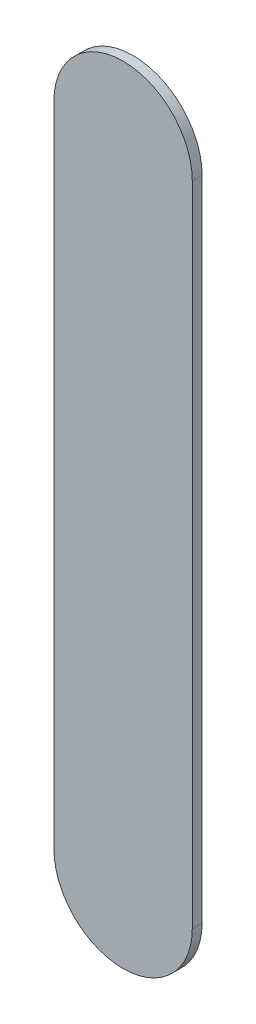
ISO-10303-21;
HEADER;
FILE_DESCRIPTION(('STEP AP214'),'2;1');
FILE_NAME('part.step','',(''),(''),'','','');
FILE_SCHEMA(('AUTOMOTIVE_DESIGN { 1 0 10303 214 1 1 1 1 }'));
ENDSEC;
DATA;
#1=APPLICATION_CONTEXT('core data for automotive mechanical design processes');
#2=APPLICATION_PROTOCOL_DEFINITION('international standard','automotive_design',2000,#1);
#3=PRODUCT_CONTEXT('',#1,'mechanical');
#4=PRODUCT('Part','Part','',(#3));
#5=PRODUCT_RELATED_PRODUCT_CATEGORY('part','',(#4));
#6=PRODUCT_DEFINITION_FORMATION('','',#4);
#7=PRODUCT_DEFINITION_CONTEXT('part definition',#1,'design');
#8=PRODUCT_DEFINITION('design','',#6,#7);
#9=PRODUCT_DEFINITION_SHAPE('','',#8);
#10=(LENGTH_UNIT() NAMED_UNIT(*) SI_UNIT(.MILLI.,.METRE.));
#11=(NAMED_UNIT(*) PLANE_ANGLE_UNIT() SI_UNIT($,.RADIAN.));
#12=(NAMED_UNIT(*) SI_UNIT($,.STERADIAN.) SOLID_ANGLE_UNIT());
#13=UNCERTAINTY_MEASURE_WITH_UNIT(LENGTH_MEASURE(1.E-05),#10,'distance_accuracy_value','');
#14=(GEOMETRIC_REPRESENTATION_CONTEXT(3) GLOBAL_UNCERTAINTY_ASSIGNED_CONTEXT((#13)) GLOBAL_UNIT_ASSIGNED_CONTEXT((#10,
#11,#12)) REPRESENTATION_CONTEXT('',''));
#15=CARTESIAN_POINT('',(0.,0.,0.));
#16=DIRECTION('',(0.,0.,1.));
#17=DIRECTION('',(1.,0.,0.));
#18=AXIS2_PLACEMENT_3D('',#15,#16,#17);
#19=CARTESIAN_POINT('',(36.14999882,84.00000218,0.));
#20=DIRECTION('',(-1.,0.,0.));
#21=DIRECTION('',(0.,1.,0.));
#22=AXIS2_PLACEMENT_3D('',#19,#20,#21);
#23=PLANE('',#22);
#24=DIRECTION('',(0.,1.,0.));
#25=VECTOR('',#24,1.);
#26=CARTESIAN_POINT('',(36.14999882,84.00000218,0.03556));
#27=LINE('',#26,#25);
#28=CARTESIAN_POINT('',(36.14999882,84.00000218,0.03556));
#29=VERTEX_POINT('',#28);
#30=CARTESIAN_POINT('',(36.14999882,86.34000258,0.03556));
#31=VERTEX_POINT('',#30);
#32=EDGE_CURVE('E11',#29,#31,#27,.T.);
#33=ORIENTED_EDGE('',*,*,#32,.F.);
#34=DIRECTION('',(0.,0.,1.));
#35=VECTOR('',#34,1.);
#36=CARTESIAN_POINT('',(36.14999882,84.00000218,0.));
#37=LINE('',#36,#35);
#38=CARTESIAN_POINT('',(36.14999882,84.00000218,0.));
#39=VERTEX_POINT('',#38);
#40=EDGE_CURVE('E24',#39,#29,#37,.T.);
#41=ORIENTED_EDGE('',*,*,#40,.F.);
#42=DIRECTION('',(0.,1.,0.));
#43=VECTOR('',#42,1.);
#44=CARTESIAN_POINT('',(36.14999882,84.00000218,0.));
#45=LINE('',#44,#43);
#46=CARTESIAN_POINT('',(36.14999882,86.34000258,0.));
#47=VERTEX_POINT('',#46);
#48=EDGE_CURVE('E75',#39,#47,#45,.T.);
#49=ORIENTED_EDGE('',*,*,#48,.T.);
#50=DIRECTION('',(0.,0.,1.));
#51=VECTOR('',#50,1.);
#52=CARTESIAN_POINT('',(36.14999882,86.34000258,0.));
#53=LINE('',#52,#51);
#54=EDGE_CURVE('E37',#47,#31,#53,.T.);
#55=ORIENTED_EDGE('',*,*,#54,.T.);
#56=EDGE_LOOP('',(#33,#41,#49,#55));
#57=FACE_BOUND('',#56,.T.);
#58=ADVANCED_FACE('F17',(#57),#23,.F.);
#59=CARTESIAN_POINT('',(35.89999932,86.34000258,0.));
#60=DIRECTION('',(0.,0.,-1.));
#61=DIRECTION('',(1.,0.,0.));
#62=AXIS2_PLACEMENT_3D('',#59,#60,#61);
#63=CYLINDRICAL_SURFACE('',#62,0.249999499999999);
#64=CARTESIAN_POINT('',(35.89999932,86.34000258,0.03556));
#65=DIRECTION('',(0.,0.,1.));
#66=DIRECTION('',(1.,0.,0.));
#67=AXIS2_PLACEMENT_3D('',#64,#65,#66);
#68=CIRCLE('',#67,0.249999499999999);
#69=CARTESIAN_POINT('',(35.64999982,86.34000258,0.03556));
#70=VERTEX_POINT('',#69);
#71=EDGE_CURVE('E83',#31,#70,#68,.T.);
#72=ORIENTED_EDGE('',*,*,#71,.F.);
#73=ORIENTED_EDGE('',*,*,#54,.F.);
#74=CARTESIAN_POINT('',(35.89999932,86.34000258,0.));
#75=DIRECTION('',(0.,0.,1.));
#76=DIRECTION('',(1.,0.,0.));
#77=AXIS2_PLACEMENT_3D('',#74,#75,#76);
#78=CIRCLE('',#77,0.249999499999999);
#79=CARTESIAN_POINT('',(35.64999982,86.34000258,0.));
#80=VERTEX_POINT('',#79);
#81=EDGE_CURVE('E81',#47,#80,#78,.T.);
#82=ORIENTED_EDGE('',*,*,#81,.T.);
#83=DIRECTION('',(0.,0.,1.));
#84=VECTOR('',#83,1.);
#85=CARTESIAN_POINT('',(35.64999982,86.34000258,0.));
#86=LINE('',#85,#84);
#87=EDGE_CURVE('E67',#80,#70,#86,.T.);
#88=ORIENTED_EDGE('',*,*,#87,.T.);
#89=EDGE_LOOP('',(#72,#73,#82,#88));
#90=FACE_BOUND('',#89,.T.);
#91=ADVANCED_FACE('F89',(#90),#63,.T.);
#92=CARTESIAN_POINT('',(35.64999982,86.34000258,0.));
#93=DIRECTION('',(1.,0.,0.));
#94=DIRECTION('',(0.,-1.,0.));
#95=AXIS2_PLACEMENT_3D('',#92,#93,#94);
#96=PLANE('',#95);
#97=DIRECTION('',(0.,-1.,0.));
#98=VECTOR('',#97,1.);
#99=CARTESIAN_POINT('',(35.64999982,86.34000258,0.03556));
#100=LINE('',#99,#98);
#101=CARTESIAN_POINT('',(35.64999982,84.00000218,0.03556));
#102=VERTEX_POINT('',#101);
#103=EDGE_CURVE('E71',#70,#102,#100,.T.);
#104=ORIENTED_EDGE('',*,*,#103,.F.);
#105=ORIENTED_EDGE('',*,*,#87,.F.);
#106=DIRECTION('',(0.,-1.,0.));
#107=VECTOR('',#106,1.);
#108=CARTESIAN_POINT('',(35.64999982,86.34000258,0.));
#109=LINE('',#108,#107);
#110=CARTESIAN_POINT('',(35.64999982,84.00000218,0.));
#111=VERTEX_POINT('',#110);
#112=EDGE_CURVE('E63',#80,#111,#109,.T.);
#113=ORIENTED_EDGE('',*,*,#112,.T.);
#114=DIRECTION('',(0.,0.,1.));
#115=VECTOR('',#114,1.);
#116=CARTESIAN_POINT('',(35.64999982,84.00000218,0.));
#117=LINE('',#116,#115);
#118=EDGE_CURVE('E53',#111,#102,#117,.T.);
#119=ORIENTED_EDGE('',*,*,#118,.T.);
#120=EDGE_LOOP('',(#104,#105,#113,#119));
#121=FACE_BOUND('',#120,.T.);
#122=ADVANCED_FACE('F66',(#121),#96,.F.);
#123=CARTESIAN_POINT('',(35.89999932,84.00000218,0.));
#124=DIRECTION('',(0.,0.,-1.));
#125=DIRECTION('',(-1.,0.,0.));
#126=AXIS2_PLACEMENT_3D('',#123,#124,#125);
#127=CYLINDRICAL_SURFACE('',#126,0.249999499999999);
#128=CARTESIAN_POINT('',(35.89999932,84.00000218,0.03556));
#129=DIRECTION('',(0.,0.,1.));
#130=DIRECTION('',(-1.,0.,0.));
#131=AXIS2_PLACEMENT_3D('',#128,#129,#130);
#132=CIRCLE('',#131,0.249999499999999);
#133=EDGE_CURVE('E59',#102,#29,#132,.T.);
#134=ORIENTED_EDGE('',*,*,#133,.F.);
#135=ORIENTED_EDGE('',*,*,#118,.F.);
#136=CARTESIAN_POINT('',(35.89999932,84.00000218,0.));
#137=DIRECTION('',(0.,0.,1.));
#138=DIRECTION('',(-1.,0.,0.));
#139=AXIS2_PLACEMENT_3D('',#136,#137,#138);
#140=CIRCLE('',#139,0.249999499999999);
#141=EDGE_CURVE('E57',#111,#39,#140,.T.);
#142=ORIENTED_EDGE('',*,*,#141,.T.);
#143=ORIENTED_EDGE('',*,*,#40,.T.);
#144=EDGE_LOOP('',(#134,#135,#142,#143));
#145=FACE_BOUND('',#144,.T.);
#146=ADVANCED_FACE('F55',(#145),#127,.T.);
#147=CARTESIAN_POINT('',(36.14999882,84.00000218,0.));
#148=DIRECTION('',(0.,0.,-1.));
#149=DIRECTION('',(-1.,0.,0.));
#150=AXIS2_PLACEMENT_3D('',#147,#148,#149);
#151=PLANE('',#150);
#152=ORIENTED_EDGE('',*,*,#141,.F.);
#153=ORIENTED_EDGE('',*,*,#112,.F.);
#154=ORIENTED_EDGE('',*,*,#81,.F.);
#155=ORIENTED_EDGE('',*,*,#48,.F.);
#156=EDGE_LOOP('',(#152,#153,#154,#155));
#157=FACE_BOUND('',#156,.T.);
#158=ADVANCED_FACE('F74',(#157),#151,.T.);
#159=CARTESIAN_POINT('',(36.14999882,84.00000218,0.03556));
#160=DIRECTION('',(0.,0.,-1.));
#161=DIRECTION('',(-1.,0.,0.));
#162=AXIS2_PLACEMENT_3D('',#159,#160,#161);
#163=PLANE('',#162);
#164=ORIENTED_EDGE('',*,*,#32,.T.);
#165=ORIENTED_EDGE('',*,*,#71,.T.);
#166=ORIENTED_EDGE('',*,*,#103,.T.);
#167=ORIENTED_EDGE('',*,*,#133,.T.);
#168=EDGE_LOOP('',(#164,#165,#166,#167));
#169=FACE_BOUND('',#168,.T.);
#170=ADVANCED_FACE('F91',(#169),#163,.F.);
#171=CLOSED_SHELL('',(#58,#91,#122,#146,#158,#170));
#172=MANIFOLD_SOLID_BREP('B1',#171);
#173=ADVANCED_BREP_SHAPE_REPRESENTATION('',(#18,#172),#14);
#174=SHAPE_DEFINITION_REPRESENTATION(#9,#173);
ENDSEC;
END-ISO-10303-21;
